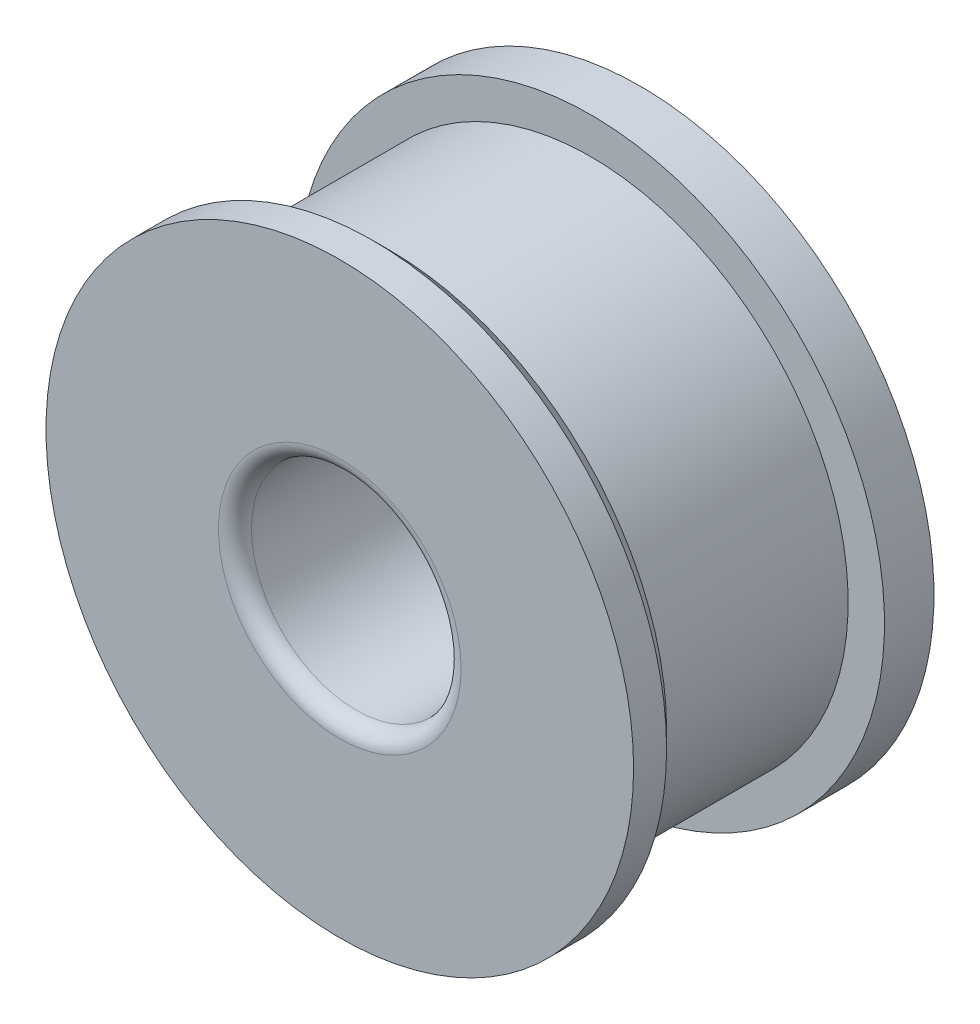
ISO-10303-21;
HEADER;
FILE_DESCRIPTION(('STEP AP214'),'2;1');
FILE_NAME('part.step','',(''),(''),'','','');
FILE_SCHEMA(('AUTOMOTIVE_DESIGN { 1 0 10303 214 1 1 1 1 }'));
ENDSEC;
DATA;
#1=APPLICATION_CONTEXT('core data for automotive mechanical design processes');
#2=APPLICATION_PROTOCOL_DEFINITION('international standard','automotive_design',2000,#1);
#3=PRODUCT_CONTEXT('',#1,'mechanical');
#4=PRODUCT('Part','Part','',(#3));
#5=PRODUCT_RELATED_PRODUCT_CATEGORY('part','',(#4));
#6=PRODUCT_DEFINITION_FORMATION('','',#4);
#7=PRODUCT_DEFINITION_CONTEXT('part definition',#1,'design');
#8=PRODUCT_DEFINITION('design','',#6,#7);
#9=PRODUCT_DEFINITION_SHAPE('','',#8);
#10=(LENGTH_UNIT() NAMED_UNIT(*) SI_UNIT(.MILLI.,.METRE.));
#11=(NAMED_UNIT(*) PLANE_ANGLE_UNIT() SI_UNIT($,.RADIAN.));
#12=(NAMED_UNIT(*) SI_UNIT($,.STERADIAN.) SOLID_ANGLE_UNIT());
#13=UNCERTAINTY_MEASURE_WITH_UNIT(LENGTH_MEASURE(1.E-05),#10,'distance_accuracy_value','');
#14=(GEOMETRIC_REPRESENTATION_CONTEXT(3) GLOBAL_UNCERTAINTY_ASSIGNED_CONTEXT((#13)) GLOBAL_UNIT_ASSIGNED_CONTEXT((#10,
#11,#12)) REPRESENTATION_CONTEXT('',''));
#15=CARTESIAN_POINT('',(0.,0.,0.));
#16=DIRECTION('',(0.,0.,1.));
#17=DIRECTION('',(1.,0.,0.));
#18=AXIS2_PLACEMENT_3D('',#15,#16,#17);
#19=CARTESIAN_POINT('',(-398.7,19.8,19.7));
#20=DIRECTION('',(0.,0.,-1.));
#21=DIRECTION('',(-1.,0.,0.));
#22=AXIS2_PLACEMENT_3D('',#19,#20,#21);
#23=CYLINDRICAL_SURFACE('',#22,7.79999999999999);
#24=CARTESIAN_POINT('',(-398.7,19.8,12.1));
#25=DIRECTION('',(0.,0.,1.));
#26=DIRECTION('',(1.,0.,0.));
#27=AXIS2_PLACEMENT_3D('',#24,#25,#26);
#28=CIRCLE('',#27,7.79999999999999);
#29=CARTESIAN_POINT('',(-406.5,19.8,12.1));
#30=VERTEX_POINT('',#29);
#31=EDGE_CURVE('E77',#30,#30,#28,.T.);
#32=CARTESIAN_POINT('',(-398.7,19.8,18.2));
#33=DIRECTION('',(0.,0.,1.));
#34=DIRECTION('',(1.,0.,0.));
#35=AXIS2_PLACEMENT_3D('',#32,#33,#34);
#36=CIRCLE('',#35,7.79999999999999);
#37=CARTESIAN_POINT('',(-406.5,19.8,18.2));
#38=VERTEX_POINT('',#37);
#39=EDGE_CURVE('E73',#38,#38,#36,.T.);
#40=CARTESIAN_POINT('',(-406.5,19.8,12.1));
#41=CARTESIAN_POINT('',(-406.5,19.8,12.1635416666667));
#42=CARTESIAN_POINT('',(-406.5,19.8,12.2270833333333));
#43=CARTESIAN_POINT('',(-406.5,19.8,12.3541666666667));
#44=CARTESIAN_POINT('',(-406.5,19.8,12.4177083333333));
#45=CARTESIAN_POINT('',(-406.5,19.8,12.5447916666667));
#46=CARTESIAN_POINT('',(-406.5,19.8,12.6083333333333));
#47=CARTESIAN_POINT('',(-406.5,19.8,12.7354166666667));
#48=CARTESIAN_POINT('',(-406.5,19.8,12.7989583333333));
#49=CARTESIAN_POINT('',(-406.5,19.8,12.9260416666667));
#50=CARTESIAN_POINT('',(-406.5,19.8,12.9895833333333));
#51=CARTESIAN_POINT('',(-406.5,19.8,13.1166666666667));
#52=CARTESIAN_POINT('',(-406.5,19.8,13.1802083333333));
#53=CARTESIAN_POINT('',(-406.5,19.8,13.3072916666667));
#54=CARTESIAN_POINT('',(-406.5,19.8,13.3708333333333));
#55=CARTESIAN_POINT('',(-406.5,19.8,13.4979166666667));
#56=CARTESIAN_POINT('',(-406.5,19.8,13.5614583333333));
#57=CARTESIAN_POINT('',(-406.5,19.8,13.6885416666667));
#58=CARTESIAN_POINT('',(-406.5,19.8,13.7520833333333));
#59=CARTESIAN_POINT('',(-406.5,19.8,13.8791666666667));
#60=CARTESIAN_POINT('',(-406.5,19.8,13.9427083333333));
#61=CARTESIAN_POINT('',(-406.5,19.8,14.0697916666667));
#62=CARTESIAN_POINT('',(-406.5,19.8,14.1333333333333));
#63=CARTESIAN_POINT('',(-406.5,19.8,14.2604166666667));
#64=CARTESIAN_POINT('',(-406.5,19.8,14.3239583333333));
#65=CARTESIAN_POINT('',(-406.5,19.8,14.4510416666667));
#66=CARTESIAN_POINT('',(-406.5,19.8,14.5145833333333));
#67=CARTESIAN_POINT('',(-406.5,19.8,14.6416666666667));
#68=CARTESIAN_POINT('',(-406.5,19.8,14.7052083333333));
#69=CARTESIAN_POINT('',(-406.5,19.8,14.8322916666667));
#70=CARTESIAN_POINT('',(-406.5,19.8,14.8958333333333));
#71=CARTESIAN_POINT('',(-406.5,19.8,15.0229166666667));
#72=CARTESIAN_POINT('',(-406.5,19.8,15.0864583333333));
#73=CARTESIAN_POINT('',(-406.5,19.8,15.2135416666667));
#74=CARTESIAN_POINT('',(-406.5,19.8,15.2770833333333));
#75=CARTESIAN_POINT('',(-406.5,19.8,15.4041666666667));
#76=CARTESIAN_POINT('',(-406.5,19.8,15.4677083333333));
#77=CARTESIAN_POINT('',(-406.5,19.8,15.5947916666667));
#78=CARTESIAN_POINT('',(-406.5,19.8,15.6583333333333));
#79=CARTESIAN_POINT('',(-406.5,19.8,15.7854166666667));
#80=CARTESIAN_POINT('',(-406.5,19.8,15.8489583333333));
#81=CARTESIAN_POINT('',(-406.5,19.8,15.9760416666667));
#82=CARTESIAN_POINT('',(-406.5,19.8,16.0395833333333));
#83=CARTESIAN_POINT('',(-406.5,19.8,16.1666666666667));
#84=CARTESIAN_POINT('',(-406.5,19.8,16.2302083333333));
#85=CARTESIAN_POINT('',(-406.5,19.8,16.3572916666667));
#86=CARTESIAN_POINT('',(-406.5,19.8,16.4208333333333));
#87=CARTESIAN_POINT('',(-406.5,19.8,16.5479166666667));
#88=CARTESIAN_POINT('',(-406.5,19.8,16.6114583333333));
#89=CARTESIAN_POINT('',(-406.5,19.8,16.7385416666667));
#90=CARTESIAN_POINT('',(-406.5,19.8,16.8020833333333));
#91=CARTESIAN_POINT('',(-406.5,19.8,16.9291666666667));
#92=CARTESIAN_POINT('',(-406.5,19.8,16.9927083333333));
#93=CARTESIAN_POINT('',(-406.5,19.8,17.1197916666667));
#94=CARTESIAN_POINT('',(-406.5,19.8,17.1833333333333));
#95=CARTESIAN_POINT('',(-406.5,19.8,17.3104166666667));
#96=CARTESIAN_POINT('',(-406.5,19.8,17.3739583333333));
#97=CARTESIAN_POINT('',(-406.5,19.8,17.5010416666667));
#98=CARTESIAN_POINT('',(-406.5,19.8,17.5645833333333));
#99=CARTESIAN_POINT('',(-406.5,19.8,17.6916666666667));
#100=CARTESIAN_POINT('',(-406.5,19.8,17.7552083333333));
#101=CARTESIAN_POINT('',(-406.5,19.8,17.8822916666667));
#102=CARTESIAN_POINT('',(-406.5,19.8,17.9458333333333));
#103=CARTESIAN_POINT('',(-406.5,19.8,18.0729166666667));
#104=CARTESIAN_POINT('',(-406.5,19.8,18.1364583333333));
#105=CARTESIAN_POINT('',(-406.5,19.8,18.2));
#106=B_SPLINE_CURVE_WITH_KNOTS('',3,(#40,#41,#42,#43,#44,#45,#46,#47,#48,#49,#50,#51,#52,#53,
#54,#55,#56,#57,#58,#59,#60,#61,#62,#63,#64,#65,#66,#67,#68,#69,#70,#71,#72,#73,#74,#75,#76,#77,
#78,#79,#80,#81,#82,#83,#84,#85,#86,#87,#88,#89,#90,#91,#92,#93,#94,#95,#96,#97,#98,#99,#100,
#101,#102,#103,#104,#105),.UNSPECIFIED.,.F.,.F.,(4,2,2,2,2,2,2,2,2,2,2,2,2,2,2,2,2,2,2,2,2,2,2,
2,2,2,2,2,2,2,2,2,4),(0.,0.190625,0.38125,0.571874999999999,0.762499999999999,0.953124999999999,
1.14375,1.334375,1.525,1.715625,1.90625,2.096875,2.2875,2.478125,2.66875,2.859375,3.05,3.240625,
3.43125,3.621875,3.8125,4.003125,4.19375,4.384375,4.575,4.765625,4.95625,5.146875,5.3375,
5.528125,5.71875,5.909375,6.1),.UNSPECIFIED.);
#107=EDGE_CURVE('BSEAM47',#30,#38,#106,.T.);
#108=ORIENTED_EDGE('',*,*,#31,.T.);
#109=ORIENTED_EDGE('',*,*,#39,.F.);
#110=ORIENTED_EDGE('',*,*,#107,.T.);
#111=ORIENTED_EDGE('',*,*,#107,.F.);
#112=EDGE_LOOP('',(#108,#110,#109,#111));
#113=FACE_BOUND('',#112,.T.);
#114=ADVANCED_FACE('F47',(#113),#23,.T.);
#115=CARTESIAN_POINT('',(-398.7,19.8,18.2));
#116=DIRECTION('',(0.,0.,1.));
#117=DIRECTION('',(1.,0.,0.));
#118=AXIS2_PLACEMENT_3D('',#115,#116,#117);
#119=CYLINDRICAL_SURFACE('',#118,8.89999999999999);
#120=CARTESIAN_POINT('',(-398.7,19.8,18.7));
#121=DIRECTION('',(0.,0.,1.));
#122=DIRECTION('',(1.,0.,0.));
#123=AXIS2_PLACEMENT_3D('',#120,#121,#122);
#124=CIRCLE('',#123,8.89999999999999);
#125=CARTESIAN_POINT('',(-389.8,19.8,18.7));
#126=VERTEX_POINT('',#125);
#127=EDGE_CURVE('E70',#126,#126,#124,.T.);
#128=ORIENTED_EDGE('',*,*,#127,.T.);
#129=EDGE_LOOP('',(#128));
#130=FACE_BOUND('',#129,.T.);
#131=CARTESIAN_POINT('',(-398.7,19.8,19.7));
#132=DIRECTION('',(0.,0.,1.));
#133=DIRECTION('',(1.,0.,0.));
#134=AXIS2_PLACEMENT_3D('',#131,#132,#133);
#135=CIRCLE('',#134,8.89999999999999);
#136=CARTESIAN_POINT('',(-389.8,19.8,19.7));
#137=VERTEX_POINT('',#136);
#138=EDGE_CURVE('E76',#137,#137,#135,.T.);
#139=ORIENTED_EDGE('',*,*,#138,.F.);
#140=EDGE_LOOP('',(#139));
#141=FACE_BOUND('',#140,.T.);
#142=ADVANCED_FACE('F113',(#130,#141),#119,.T.);
#143=CARTESIAN_POINT('',(-398.7,19.8,18.2));
#144=DIRECTION('',(0.,0.,1.));
#145=DIRECTION('',(1.,0.,0.));
#146=AXIS2_PLACEMENT_3D('',#143,#144,#145);
#147=PLANE('',#146);
#148=CARTESIAN_POINT('',(-398.7,19.8,18.2));
#149=DIRECTION('',(0.,0.,1.));
#150=DIRECTION('',(1.,0.,0.));
#151=AXIS2_PLACEMENT_3D('',#148,#149,#150);
#152=CIRCLE('',#151,8.39999999999996);
#153=CARTESIAN_POINT('',(-390.3,19.8,18.2));
#154=VERTEX_POINT('',#153);
#155=EDGE_CURVE('E67',#154,#154,#152,.F.);
#156=ORIENTED_EDGE('',*,*,#155,.T.);
#157=EDGE_LOOP('',(#156));
#158=FACE_BOUND('',#157,.T.);
#159=ORIENTED_EDGE('',*,*,#39,.T.);
#160=EDGE_LOOP('',(#159));
#161=FACE_BOUND('',#160,.T.);
#162=ADVANCED_FACE('F119',(#158,#161),#147,.F.);
#163=CARTESIAN_POINT('',(-398.7,19.8,19.7));
#164=DIRECTION('',(0.,0.,1.));
#165=DIRECTION('',(1.,0.,0.));
#166=AXIS2_PLACEMENT_3D('',#163,#164,#165);
#167=PLANE('',#166);
#168=CARTESIAN_POINT('',(-398.7,19.8,19.7));
#169=DIRECTION('',(0.,0.,1.));
#170=DIRECTION('',(1.,0.,0.));
#171=AXIS2_PLACEMENT_3D('',#168,#169,#170);
#172=CIRCLE('',#171,3.67499999999997);
#173=CARTESIAN_POINT('',(-395.025,19.8,19.7));
#174=VERTEX_POINT('',#173);
#175=EDGE_CURVE('E10',#174,#174,#172,.F.);
#176=ORIENTED_EDGE('',*,*,#175,.T.);
#177=EDGE_LOOP('',(#176));
#178=FACE_BOUND('',#177,.T.);
#179=ORIENTED_EDGE('',*,*,#138,.T.);
#180=EDGE_LOOP('',(#179));
#181=FACE_BOUND('',#180,.T.);
#182=ADVANCED_FACE('F125',(#178,#181),#167,.T.);
#183=CARTESIAN_POINT('',(-398.7,19.8,18.7));
#184=DIRECTION('',(0.,0.,1.));
#185=DIRECTION('',(1.,0.,0.));
#186=AXIS2_PLACEMENT_3D('',#183,#184,#185);
#187=CONICAL_SURFACE('',#186,8.89999999999999,0.785398163397464);
#188=ORIENTED_EDGE('',*,*,#155,.F.);
#189=EDGE_LOOP('',(#188));
#190=FACE_BOUND('',#189,.T.);
#191=ORIENTED_EDGE('',*,*,#127,.F.);
#192=EDGE_LOOP('',(#191));
#193=FACE_BOUND('',#192,.T.);
#194=ADVANCED_FACE('F94',(#190,#193),#187,.T.);
#195=CARTESIAN_POINT('',(-398.7,19.8,10.6));
#196=DIRECTION('',(0.,0.,1.));
#197=DIRECTION('',(1.,0.,0.));
#198=AXIS2_PLACEMENT_3D('',#195,#196,#197);
#199=CYLINDRICAL_SURFACE('',#198,8.89999999999999);
#200=CARTESIAN_POINT('',(-398.7,19.8,10.6));
#201=DIRECTION('',(0.,0.,-1.));
#202=DIRECTION('',(-1.,0.,0.));
#203=AXIS2_PLACEMENT_3D('',#200,#201,#202);
#204=CIRCLE('',#203,8.89999999999999);
#205=CARTESIAN_POINT('',(-407.6,19.8,10.6));
#206=VERTEX_POINT('',#205);
#207=EDGE_CURVE('E80',#206,#206,#204,.T.);
#208=ORIENTED_EDGE('',*,*,#207,.F.);
#209=EDGE_LOOP('',(#208));
#210=FACE_BOUND('',#209,.T.);
#211=CARTESIAN_POINT('',(-398.7,19.8,12.1));
#212=DIRECTION('',(0.,0.,-1.));
#213=DIRECTION('',(-1.,0.,0.));
#214=AXIS2_PLACEMENT_3D('',#211,#212,#213);
#215=CIRCLE('',#214,8.89999999999999);
#216=CARTESIAN_POINT('',(-407.6,19.8,12.1));
#217=VERTEX_POINT('',#216);
#218=EDGE_CURVE('E83',#217,#217,#215,.T.);
#219=ORIENTED_EDGE('',*,*,#218,.T.);
#220=EDGE_LOOP('',(#219));
#221=FACE_BOUND('',#220,.T.);
#222=ADVANCED_FACE('F91',(#210,#221),#199,.T.);
#223=CARTESIAN_POINT('',(-398.7,19.8,10.6));
#224=DIRECTION('',(0.,0.,-1.));
#225=DIRECTION('',(-1.,0.,0.));
#226=AXIS2_PLACEMENT_3D('',#223,#224,#225);
#227=PLANE('',#226);
#228=CARTESIAN_POINT('',(-398.7,19.8,10.6));
#229=DIRECTION('',(0.,0.,-1.));
#230=DIRECTION('',(-1.,0.,0.));
#231=AXIS2_PLACEMENT_3D('',#228,#229,#230);
#232=CIRCLE('',#231,3.67499999999997);
#233=CARTESIAN_POINT('',(-402.375,19.8,10.6));
#234=VERTEX_POINT('',#233);
#235=EDGE_CURVE('E62',#234,#234,#232,.F.);
#236=ORIENTED_EDGE('',*,*,#235,.T.);
#237=EDGE_LOOP('',(#236));
#238=FACE_BOUND('',#237,.T.);
#239=ORIENTED_EDGE('',*,*,#207,.T.);
#240=EDGE_LOOP('',(#239));
#241=FACE_BOUND('',#240,.T.);
#242=ADVANCED_FACE('F89',(#238,#241),#227,.T.);
#243=CARTESIAN_POINT('',(-398.7,19.8,12.1));
#244=DIRECTION('',(0.,0.,-1.));
#245=DIRECTION('',(-1.,0.,0.));
#246=AXIS2_PLACEMENT_3D('',#243,#244,#245);
#247=PLANE('',#246);
#248=ORIENTED_EDGE('',*,*,#31,.F.);
#249=EDGE_LOOP('',(#248));
#250=FACE_BOUND('',#249,.T.);
#251=ORIENTED_EDGE('',*,*,#218,.F.);
#252=EDGE_LOOP('',(#251));
#253=FACE_BOUND('',#252,.T.);
#254=ADVANCED_FACE('F98',(#250,#253),#247,.F.);
#255=CARTESIAN_POINT('',(-398.7,19.8,35.7));
#256=DIRECTION('',(0.,0.,-1.));
#257=DIRECTION('',(-1.,0.,0.));
#258=AXIS2_PLACEMENT_3D('',#255,#256,#257);
#259=CYLINDRICAL_SURFACE('',#258,3.17499999999997);
#260=CARTESIAN_POINT('',(-398.7,19.8,11.1));
#261=DIRECTION('',(0.,0.,-1.));
#262=DIRECTION('',(-1.,0.,0.));
#263=AXIS2_PLACEMENT_3D('',#260,#261,#262);
#264=CIRCLE('',#263,3.17499999999997);
#265=CARTESIAN_POINT('',(-401.875,19.8,11.1));
#266=VERTEX_POINT('',#265);
#267=EDGE_CURVE('E54',#266,#266,#264,.T.);
#268=ORIENTED_EDGE('',*,*,#267,.T.);
#269=EDGE_LOOP('',(#268));
#270=FACE_BOUND('',#269,.T.);
#271=CARTESIAN_POINT('',(-398.7,19.8,19.2));
#272=DIRECTION('',(0.,0.,1.));
#273=DIRECTION('',(1.,0.,0.));
#274=AXIS2_PLACEMENT_3D('',#271,#272,#273);
#275=CIRCLE('',#274,3.17499999999997);
#276=CARTESIAN_POINT('',(-395.525,19.8,19.2));
#277=VERTEX_POINT('',#276);
#278=EDGE_CURVE('E58',#277,#277,#275,.T.);
#279=ORIENTED_EDGE('',*,*,#278,.T.);
#280=EDGE_LOOP('',(#279));
#281=FACE_BOUND('',#280,.T.);
#282=ADVANCED_FACE('F100',(#270,#281),#259,.F.);
#283=CARTESIAN_POINT('',(-398.7,19.8,11.1));
#284=DIRECTION('',(0.,0.,-1.));
#285=DIRECTION('',(-1.,0.,0.));
#286=AXIS2_PLACEMENT_3D('',#283,#284,#285);
#287=TOROIDAL_SURFACE('',#286,3.67499999999997,0.5);
#288=ORIENTED_EDGE('',*,*,#267,.F.);
#289=EDGE_LOOP('',(#288));
#290=FACE_BOUND('',#289,.T.);
#291=ORIENTED_EDGE('',*,*,#235,.F.);
#292=EDGE_LOOP('',(#291));
#293=FACE_BOUND('',#292,.T.);
#294=ADVANCED_FACE('F107',(#290,#293),#287,.T.);
#295=CARTESIAN_POINT('',(-398.7,19.8,19.2));
#296=DIRECTION('',(0.,0.,1.));
#297=DIRECTION('',(1.,0.,0.));
#298=AXIS2_PLACEMENT_3D('',#295,#296,#297);
#299=TOROIDAL_SURFACE('',#298,3.67499999999997,0.5);
#300=ORIENTED_EDGE('',*,*,#278,.F.);
#301=EDGE_LOOP('',(#300));
#302=FACE_BOUND('',#301,.T.);
#303=ORIENTED_EDGE('',*,*,#175,.F.);
#304=EDGE_LOOP('',(#303));
#305=FACE_BOUND('',#304,.T.);
#306=ADVANCED_FACE('F49',(#302,#305),#299,.T.);
#307=CLOSED_SHELL('',(#114,#142,#162,#182,#194,#222,#242,#254,#282,#294,#306));
#308=MANIFOLD_SOLID_BREP('B2',#307);
#309=ADVANCED_BREP_SHAPE_REPRESENTATION('',(#18,#308),#14);
#310=SHAPE_DEFINITION_REPRESENTATION(#9,#309);
ENDSEC;
END-ISO-10303-21;
